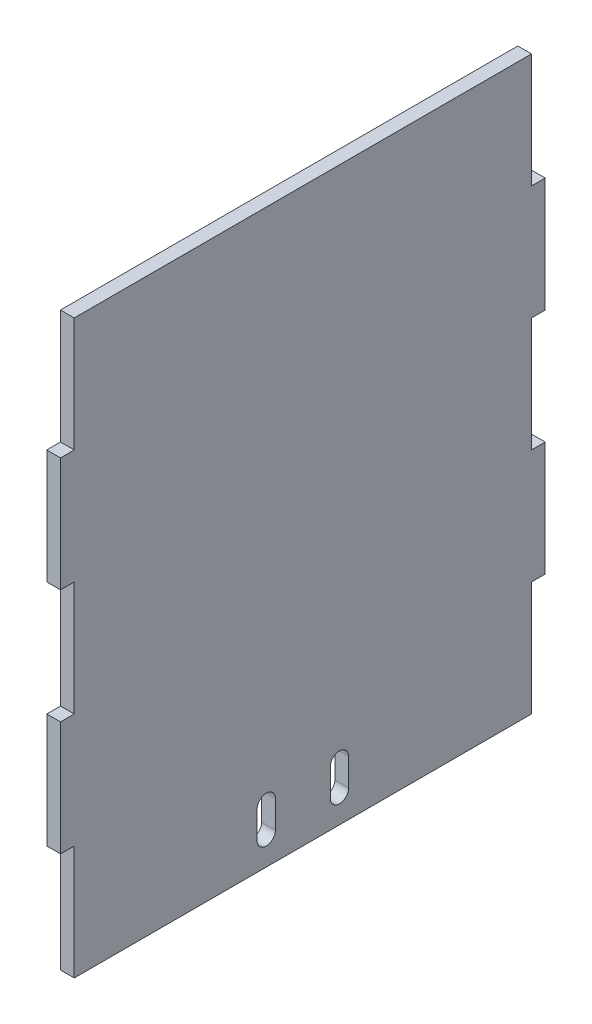
ISO-10303-21;
HEADER;
FILE_DESCRIPTION(('STEP AP214'),'2;1');
FILE_NAME('part.step','',(''),(''),'','','');
FILE_SCHEMA(('AUTOMOTIVE_DESIGN { 1 0 10303 214 1 1 1 1 }'));
ENDSEC;
DATA;
#1=APPLICATION_CONTEXT('core data for automotive mechanical design processes');
#2=APPLICATION_PROTOCOL_DEFINITION('international standard','automotive_design',2000,#1);
#3=PRODUCT_CONTEXT('',#1,'mechanical');
#4=PRODUCT('Part','Part','',(#3));
#5=PRODUCT_RELATED_PRODUCT_CATEGORY('part','',(#4));
#6=PRODUCT_DEFINITION_FORMATION('','',#4);
#7=PRODUCT_DEFINITION_CONTEXT('part definition',#1,'design');
#8=PRODUCT_DEFINITION('design','',#6,#7);
#9=PRODUCT_DEFINITION_SHAPE('','',#8);
#10=(LENGTH_UNIT() NAMED_UNIT(*) SI_UNIT(.MILLI.,.METRE.));
#11=(NAMED_UNIT(*) PLANE_ANGLE_UNIT() SI_UNIT($,.RADIAN.));
#12=(NAMED_UNIT(*) SI_UNIT($,.STERADIAN.) SOLID_ANGLE_UNIT());
#13=UNCERTAINTY_MEASURE_WITH_UNIT(LENGTH_MEASURE(1.E-05),#10,'distance_accuracy_value','');
#14=(GEOMETRIC_REPRESENTATION_CONTEXT(3) GLOBAL_UNCERTAINTY_ASSIGNED_CONTEXT((#13)) GLOBAL_UNIT_ASSIGNED_CONTEXT((#10,
#11,#12)) REPRESENTATION_CONTEXT('',''));
#15=CARTESIAN_POINT('',(0.,0.,0.));
#16=DIRECTION('',(0.,0.,1.));
#17=DIRECTION('',(1.,0.,0.));
#18=AXIS2_PLACEMENT_3D('',#15,#16,#17);
#19=CARTESIAN_POINT('',(3.,28.1962845668765,-53.4829411016602));
#20=DIRECTION('',(0.,0.,1.));
#21=DIRECTION('',(0.,-1.,0.));
#22=AXIS2_PLACEMENT_3D('',#19,#20,#21);
#23=PLANE('',#22);
#24=DIRECTION('',(0.,1.,0.));
#25=VECTOR('',#24,1.);
#26=CARTESIAN_POINT('',(0.,28.1962845668765,-53.4829411016602));
#27=LINE('',#26,#25);
#28=CARTESIAN_POINT('',(0.,3.19628456687655,-53.4829411016604));
#29=VERTEX_POINT('',#28);
#30=CARTESIAN_POINT('',(0.,28.1962845668765,-53.4829411016602));
#31=VERTEX_POINT('',#30);
#32=EDGE_CURVE('E254',#29,#31,#27,.T.);
#33=ORIENTED_EDGE('',*,*,#32,.T.);
#34=DIRECTION('',(-1.,0.,0.));
#35=VECTOR('',#34,1.);
#36=CARTESIAN_POINT('',(3.,28.1962845668765,-53.4829411016602));
#37=LINE('',#36,#35);
#38=CARTESIAN_POINT('',(3.,28.1962845668765,-53.4829411016602));
#39=VERTEX_POINT('',#38);
#40=EDGE_CURVE('E11',#39,#31,#37,.T.);
#41=ORIENTED_EDGE('',*,*,#40,.F.);
#42=DIRECTION('',(0.,1.,0.));
#43=VECTOR('',#42,1.);
#44=CARTESIAN_POINT('',(3.,28.1962845668765,-53.4829411016602));
#45=LINE('',#44,#43);
#46=CARTESIAN_POINT('',(3.,3.19628456687655,-53.4829411016604));
#47=VERTEX_POINT('',#46);
#48=EDGE_CURVE('E287',#47,#39,#45,.T.);
#49=ORIENTED_EDGE('',*,*,#48,.F.);
#50=DIRECTION('',(-1.,0.,0.));
#51=VECTOR('',#50,1.);
#52=CARTESIAN_POINT('',(3.,3.19628456687655,-53.4829411016604));
#53=LINE('',#52,#51);
#54=EDGE_CURVE('E329',#47,#29,#53,.T.);
#55=ORIENTED_EDGE('',*,*,#54,.T.);
#56=EDGE_LOOP('',(#33,#41,#49,#55));
#57=FACE_BOUND('',#56,.T.);
#58=ADVANCED_FACE('F33',(#57),#23,.F.);
#59=CARTESIAN_POINT('',(3.,28.1962845668768,46.5170588983396));
#60=DIRECTION('',(0.,-1.,0.));
#61=DIRECTION('',(0.,0.,-1.));
#62=AXIS2_PLACEMENT_3D('',#59,#60,#61);
#63=PLANE('',#62);
#64=DIRECTION('',(0.,0.,1.));
#65=VECTOR('',#64,1.);
#66=CARTESIAN_POINT('',(0.,28.1962845668768,46.5170588983396));
#67=LINE('',#66,#65);
#68=CARTESIAN_POINT('',(0.,28.1962845668768,46.5170588983396));
#69=VERTEX_POINT('',#68);
#70=EDGE_CURVE('E332',#31,#69,#67,.T.);
#71=ORIENTED_EDGE('',*,*,#70,.T.);
#72=DIRECTION('',(-1.,0.,0.));
#73=VECTOR('',#72,1.);
#74=CARTESIAN_POINT('',(3.,28.1962845668768,46.5170588983396));
#75=LINE('',#74,#73);
#76=CARTESIAN_POINT('',(3.,28.1962845668768,46.5170588983396));
#77=VERTEX_POINT('',#76);
#78=EDGE_CURVE('E40',#77,#69,#75,.T.);
#79=ORIENTED_EDGE('',*,*,#78,.F.);
#80=DIRECTION('',(0.,0.,1.));
#81=VECTOR('',#80,1.);
#82=CARTESIAN_POINT('',(3.,28.1962845668768,46.5170588983396));
#83=LINE('',#82,#81);
#84=EDGE_CURVE('E290',#39,#77,#83,.T.);
#85=ORIENTED_EDGE('',*,*,#84,.F.);
#86=ORIENTED_EDGE('',*,*,#40,.T.);
#87=EDGE_LOOP('',(#71,#79,#85,#86));
#88=FACE_BOUND('',#87,.T.);
#89=ADVANCED_FACE('F448',(#88),#63,.F.);
#90=CARTESIAN_POINT('',(3.,28.1962845668768,46.5170588983396));
#91=DIRECTION('',(0.,0.,-1.));
#92=DIRECTION('',(0.,1.,0.));
#93=AXIS2_PLACEMENT_3D('',#90,#91,#92);
#94=PLANE('',#93);
#95=DIRECTION('',(0.,-1.,0.));
#96=VECTOR('',#95,1.);
#97=CARTESIAN_POINT('',(0.,28.1962845668768,46.5170588983396));
#98=LINE('',#97,#96);
#99=CARTESIAN_POINT('',(0.,3.1962845668768,46.51705889834));
#100=VERTEX_POINT('',#99);
#101=EDGE_CURVE('E334',#69,#100,#98,.T.);
#102=ORIENTED_EDGE('',*,*,#101,.T.);
#103=DIRECTION('',(-1.,0.,0.));
#104=VECTOR('',#103,1.);
#105=CARTESIAN_POINT('',(3.,3.1962845668768,46.51705889834));
#106=LINE('',#105,#104);
#107=CARTESIAN_POINT('',(3.,3.1962845668768,46.51705889834));
#108=VERTEX_POINT('',#107);
#109=EDGE_CURVE('E419',#108,#100,#106,.T.);
#110=ORIENTED_EDGE('',*,*,#109,.F.);
#111=DIRECTION('',(0.,-1.,0.));
#112=VECTOR('',#111,1.);
#113=CARTESIAN_POINT('',(3.,28.1962845668768,46.5170588983396));
#114=LINE('',#113,#112);
#115=EDGE_CURVE('E293',#77,#108,#114,.T.);
#116=ORIENTED_EDGE('',*,*,#115,.F.);
#117=ORIENTED_EDGE('',*,*,#78,.T.);
#118=EDGE_LOOP('',(#102,#110,#116,#117));
#119=FACE_BOUND('',#118,.T.);
#120=ADVANCED_FACE('F426',(#119),#94,.F.);
#121=CARTESIAN_POINT('',(3.,3.1962845668768,46.51705889834));
#122=DIRECTION('',(0.,-1.,0.));
#123=DIRECTION('',(0.,0.,-1.));
#124=AXIS2_PLACEMENT_3D('',#121,#122,#123);
#125=PLANE('',#124);
#126=DIRECTION('',(0.,0.,1.));
#127=VECTOR('',#126,1.);
#128=CARTESIAN_POINT('',(0.,3.1962845668768,46.51705889834));
#129=LINE('',#128,#127);
#130=CARTESIAN_POINT('',(0.,3.19628456687685,49.51705889834));
#131=VERTEX_POINT('',#130);
#132=EDGE_CURVE('E336',#100,#131,#129,.T.);
#133=ORIENTED_EDGE('',*,*,#132,.T.);
#134=DIRECTION('',(-1.,0.,0.));
#135=VECTOR('',#134,1.);
#136=CARTESIAN_POINT('',(3.,3.19628456687685,49.51705889834));
#137=LINE('',#136,#135);
#138=CARTESIAN_POINT('',(3.,3.19628456687685,49.51705889834));
#139=VERTEX_POINT('',#138);
#140=EDGE_CURVE('E416',#139,#131,#137,.T.);
#141=ORIENTED_EDGE('',*,*,#140,.F.);
#142=DIRECTION('',(0.,0.,1.));
#143=VECTOR('',#142,1.);
#144=CARTESIAN_POINT('',(3.,3.1962845668768,46.51705889834));
#145=LINE('',#144,#143);
#146=EDGE_CURVE('E295',#108,#139,#145,.T.);
#147=ORIENTED_EDGE('',*,*,#146,.F.);
#148=ORIENTED_EDGE('',*,*,#109,.T.);
#149=EDGE_LOOP('',(#133,#141,#147,#148));
#150=FACE_BOUND('',#149,.T.);
#151=ADVANCED_FACE('F436',(#150),#125,.F.);
#152=CARTESIAN_POINT('',(3.,3.19628456687685,49.51705889834));
#153=DIRECTION('',(0.,0.,-1.));
#154=DIRECTION('',(0.,1.,0.));
#155=AXIS2_PLACEMENT_3D('',#152,#153,#154);
#156=PLANE('',#155);
#157=DIRECTION('',(0.,-1.,0.));
#158=VECTOR('',#157,1.);
#159=CARTESIAN_POINT('',(0.,3.19628456687685,49.51705889834));
#160=LINE('',#159,#158);
#161=CARTESIAN_POINT('',(0.,-21.8037154331232,49.5170588983404));
#162=VERTEX_POINT('',#161);
#163=EDGE_CURVE('E338',#131,#162,#160,.T.);
#164=ORIENTED_EDGE('',*,*,#163,.T.);
#165=DIRECTION('',(-1.,0.,0.));
#166=VECTOR('',#165,1.);
#167=CARTESIAN_POINT('',(3.,-21.8037154331232,49.5170588983404));
#168=LINE('',#167,#166);
#169=CARTESIAN_POINT('',(3.,-21.8037154331232,49.5170588983404));
#170=VERTEX_POINT('',#169);
#171=EDGE_CURVE('E413',#170,#162,#168,.T.);
#172=ORIENTED_EDGE('',*,*,#171,.F.);
#173=DIRECTION('',(0.,-1.,0.));
#174=VECTOR('',#173,1.);
#175=CARTESIAN_POINT('',(3.,3.19628456687685,49.51705889834));
#176=LINE('',#175,#174);
#177=EDGE_CURVE('E297',#139,#170,#176,.T.);
#178=ORIENTED_EDGE('',*,*,#177,.F.);
#179=ORIENTED_EDGE('',*,*,#140,.T.);
#180=EDGE_LOOP('',(#164,#172,#178,#179));
#181=FACE_BOUND('',#180,.T.);
#182=ADVANCED_FACE('F440',(#181),#156,.F.);
#183=CARTESIAN_POINT('',(3.,-21.8037154331232,49.5170588983404));
#184=DIRECTION('',(0.,1.,0.));
#185=DIRECTION('',(0.,0.,1.));
#186=AXIS2_PLACEMENT_3D('',#183,#184,#185);
#187=PLANE('',#186);
#188=DIRECTION('',(0.,0.,-1.));
#189=VECTOR('',#188,1.);
#190=CARTESIAN_POINT('',(0.,-21.8037154331232,49.5170588983404));
#191=LINE('',#190,#189);
#192=CARTESIAN_POINT('',(0.,-21.8037154331234,46.5170588983391));
#193=VERTEX_POINT('',#192);
#194=EDGE_CURVE('E340',#162,#193,#191,.T.);
#195=ORIENTED_EDGE('',*,*,#194,.T.);
#196=DIRECTION('',(-1.,0.,0.));
#197=VECTOR('',#196,1.);
#198=CARTESIAN_POINT('',(3.,-21.8037154331234,46.5170588983391));
#199=LINE('',#198,#197);
#200=CARTESIAN_POINT('',(3.,-21.8037154331234,46.5170588983391));
#201=VERTEX_POINT('',#200);
#202=EDGE_CURVE('E410',#201,#193,#199,.T.);
#203=ORIENTED_EDGE('',*,*,#202,.F.);
#204=DIRECTION('',(0.,0.,-1.));
#205=VECTOR('',#204,1.);
#206=CARTESIAN_POINT('',(3.,-21.8037154331232,49.5170588983404));
#207=LINE('',#206,#205);
#208=EDGE_CURVE('E299',#170,#201,#207,.T.);
#209=ORIENTED_EDGE('',*,*,#208,.F.);
#210=ORIENTED_EDGE('',*,*,#171,.T.);
#211=EDGE_LOOP('',(#195,#203,#209,#210));
#212=FACE_BOUND('',#211,.T.);
#213=ADVANCED_FACE('F521',(#212),#187,.F.);
#214=CARTESIAN_POINT('',(3.,-21.8037154331234,46.5170588983391));
#215=DIRECTION('',(0.,0.,-1.));
#216=DIRECTION('',(0.,1.,0.));
#217=AXIS2_PLACEMENT_3D('',#214,#215,#216);
#218=PLANE('',#217);
#219=DIRECTION('',(0.,-1.,0.));
#220=VECTOR('',#219,1.);
#221=CARTESIAN_POINT('',(0.,-21.8037154331234,46.5170588983391));
#222=LINE('',#221,#220);
#223=CARTESIAN_POINT('',(0.,-46.803715433124,46.5170588983401));
#224=VERTEX_POINT('',#223);
#225=EDGE_CURVE('E342',#193,#224,#222,.T.);
#226=ORIENTED_EDGE('',*,*,#225,.T.);
#227=DIRECTION('',(-1.,0.,0.));
#228=VECTOR('',#227,1.);
#229=CARTESIAN_POINT('',(3.,-46.803715433124,46.5170588983401));
#230=LINE('',#229,#228);
#231=CARTESIAN_POINT('',(3.,-46.803715433124,46.5170588983401));
#232=VERTEX_POINT('',#231);
#233=EDGE_CURVE('E407',#232,#224,#230,.T.);
#234=ORIENTED_EDGE('',*,*,#233,.F.);
#235=DIRECTION('',(0.,-1.,0.));
#236=VECTOR('',#235,1.);
#237=CARTESIAN_POINT('',(3.,-21.8037154331234,46.5170588983391));
#238=LINE('',#237,#236);
#239=EDGE_CURVE('E301',#201,#232,#238,.T.);
#240=ORIENTED_EDGE('',*,*,#239,.F.);
#241=ORIENTED_EDGE('',*,*,#202,.T.);
#242=EDGE_LOOP('',(#226,#234,#240,#241));
#243=FACE_BOUND('',#242,.T.);
#244=ADVANCED_FACE('F519',(#243),#218,.F.);
#245=CARTESIAN_POINT('',(3.,-46.803715433124,46.5170588983401));
#246=DIRECTION('',(0.,-1.,0.));
#247=DIRECTION('',(0.,0.,-1.));
#248=AXIS2_PLACEMENT_3D('',#245,#246,#247);
#249=PLANE('',#248);
#250=DIRECTION('',(0.,0.,1.));
#251=VECTOR('',#250,1.);
#252=CARTESIAN_POINT('',(0.,-46.803715433124,46.5170588983401));
#253=LINE('',#252,#251);
#254=CARTESIAN_POINT('',(0.,-46.803715433124,49.5170588983401));
#255=VERTEX_POINT('',#254);
#256=EDGE_CURVE('E344',#224,#255,#253,.T.);
#257=ORIENTED_EDGE('',*,*,#256,.T.);
#258=DIRECTION('',(-1.,0.,0.));
#259=VECTOR('',#258,1.);
#260=CARTESIAN_POINT('',(3.,-46.803715433124,49.5170588983401));
#261=LINE('',#260,#259);
#262=CARTESIAN_POINT('',(3.,-46.803715433124,49.5170588983401));
#263=VERTEX_POINT('',#262);
#264=EDGE_CURVE('E404',#263,#255,#261,.T.);
#265=ORIENTED_EDGE('',*,*,#264,.F.);
#266=DIRECTION('',(0.,0.,1.));
#267=VECTOR('',#266,1.);
#268=CARTESIAN_POINT('',(3.,-46.803715433124,46.5170588983401));
#269=LINE('',#268,#267);
#270=EDGE_CURVE('E303',#232,#263,#269,.T.);
#271=ORIENTED_EDGE('',*,*,#270,.F.);
#272=ORIENTED_EDGE('',*,*,#233,.T.);
#273=EDGE_LOOP('',(#257,#265,#271,#272));
#274=FACE_BOUND('',#273,.T.);
#275=ADVANCED_FACE('F514',(#274),#249,.F.);
#276=CARTESIAN_POINT('',(3.,-46.803715433124,49.5170588983401));
#277=DIRECTION('',(0.,0.,-1.));
#278=DIRECTION('',(-1.,0.,0.));
#279=AXIS2_PLACEMENT_3D('',#276,#277,#278);
#280=PLANE('',#279);
#281=DIRECTION('',(0.,-1.,0.));
#282=VECTOR('',#281,1.);
#283=CARTESIAN_POINT('',(0.,-46.803715433124,49.5170588983401));
#284=LINE('',#283,#282);
#285=CARTESIAN_POINT('',(0.,-71.803715433124,49.5170588983401));
#286=VERTEX_POINT('',#285);
#287=EDGE_CURVE('E346',#255,#286,#284,.T.);
#288=ORIENTED_EDGE('',*,*,#287,.T.);
#289=DIRECTION('',(-1.,0.,0.));
#290=VECTOR('',#289,1.);
#291=CARTESIAN_POINT('',(3.,-71.803715433124,49.5170588983401));
#292=LINE('',#291,#290);
#293=CARTESIAN_POINT('',(3.,-71.803715433124,49.5170588983401));
#294=VERTEX_POINT('',#293);
#295=EDGE_CURVE('E401',#294,#286,#292,.T.);
#296=ORIENTED_EDGE('',*,*,#295,.F.);
#297=DIRECTION('',(0.,-1.,0.));
#298=VECTOR('',#297,1.);
#299=CARTESIAN_POINT('',(3.,-46.803715433124,49.5170588983401));
#300=LINE('',#299,#298);
#301=EDGE_CURVE('E305',#263,#294,#300,.T.);
#302=ORIENTED_EDGE('',*,*,#301,.F.);
#303=ORIENTED_EDGE('',*,*,#264,.T.);
#304=EDGE_LOOP('',(#288,#296,#302,#303));
#305=FACE_BOUND('',#304,.T.);
#306=ADVANCED_FACE('F509',(#305),#280,.F.);
#307=CARTESIAN_POINT('',(3.,-71.803715433124,49.5170588983401));
#308=DIRECTION('',(0.,1.,0.));
#309=DIRECTION('',(0.,0.,1.));
#310=AXIS2_PLACEMENT_3D('',#307,#308,#309);
#311=PLANE('',#310);
#312=DIRECTION('',(0.,0.,-1.));
#313=VECTOR('',#312,1.);
#314=CARTESIAN_POINT('',(0.,-71.803715433124,49.5170588983401));
#315=LINE('',#314,#313);
#316=CARTESIAN_POINT('',(0.,-71.803715433124,46.5170588983401));
#317=VERTEX_POINT('',#316);
#318=EDGE_CURVE('E348',#286,#317,#315,.T.);
#319=ORIENTED_EDGE('',*,*,#318,.T.);
#320=DIRECTION('',(-1.,0.,0.));
#321=VECTOR('',#320,1.);
#322=CARTESIAN_POINT('',(3.,-71.803715433124,46.5170588983401));
#323=LINE('',#322,#321);
#324=CARTESIAN_POINT('',(3.,-71.803715433124,46.5170588983401));
#325=VERTEX_POINT('',#324);
#326=EDGE_CURVE('E398',#325,#317,#323,.T.);
#327=ORIENTED_EDGE('',*,*,#326,.F.);
#328=DIRECTION('',(0.,0.,-1.));
#329=VECTOR('',#328,1.);
#330=CARTESIAN_POINT('',(3.,-71.803715433124,49.5170588983401));
#331=LINE('',#330,#329);
#332=EDGE_CURVE('E307',#294,#325,#331,.T.);
#333=ORIENTED_EDGE('',*,*,#332,.F.);
#334=ORIENTED_EDGE('',*,*,#295,.T.);
#335=EDGE_LOOP('',(#319,#327,#333,#334));
#336=FACE_BOUND('',#335,.T.);
#337=ADVANCED_FACE('F505',(#336),#311,.F.);
#338=CARTESIAN_POINT('',(3.,-96.803715433124,46.5170588983358));
#339=DIRECTION('',(0.,1.71251901548431E-13,-1.));
#340=DIRECTION('',(0.,1.,1.71251901548431E-13));
#341=AXIS2_PLACEMENT_3D('',#338,#339,#340);
#342=PLANE('',#341);
#343=DIRECTION('',(0.,-1.,-1.71251901548431E-13));
#344=VECTOR('',#343,1.);
#345=CARTESIAN_POINT('',(0.,-96.803715433124,46.5170588983358));
#346=LINE('',#345,#344);
#347=CARTESIAN_POINT('',(0.,-96.803715433124,46.5170588983358));
#348=VERTEX_POINT('',#347);
#349=EDGE_CURVE('E350',#317,#348,#346,.T.);
#350=ORIENTED_EDGE('',*,*,#349,.T.);
#351=DIRECTION('',(-1.,0.,0.));
#352=VECTOR('',#351,1.);
#353=CARTESIAN_POINT('',(3.,-96.803715433124,46.5170588983358));
#354=LINE('',#353,#352);
#355=CARTESIAN_POINT('',(3.,-96.803715433124,46.5170588983358));
#356=VERTEX_POINT('',#355);
#357=EDGE_CURVE('E395',#356,#348,#354,.T.);
#358=ORIENTED_EDGE('',*,*,#357,.F.);
#359=DIRECTION('',(0.,-1.,-1.71251901548431E-13));
#360=VECTOR('',#359,1.);
#361=CARTESIAN_POINT('',(3.,-96.803715433124,46.5170588983358));
#362=LINE('',#361,#360);
#363=EDGE_CURVE('E309',#325,#356,#362,.T.);
#364=ORIENTED_EDGE('',*,*,#363,.F.);
#365=ORIENTED_EDGE('',*,*,#326,.T.);
#366=EDGE_LOOP('',(#350,#358,#364,#365));
#367=FACE_BOUND('',#366,.T.);
#368=ADVANCED_FACE('F500',(#367),#342,.F.);
#369=CARTESIAN_POINT('',(3.,-96.803715433124,-53.4829411016566));
#370=DIRECTION('',(0.,1.,0.));
#371=DIRECTION('',(0.,0.,1.));
#372=AXIS2_PLACEMENT_3D('',#369,#370,#371);
#373=PLANE('',#372);
#374=DIRECTION('',(0.,0.,-1.));
#375=VECTOR('',#374,1.);
#376=CARTESIAN_POINT('',(0.,-96.803715433124,-53.4829411016566));
#377=LINE('',#376,#375);
#378=CARTESIAN_POINT('',(0.,-96.803715433124,-53.4829411016566));
#379=VERTEX_POINT('',#378);
#380=EDGE_CURVE('E352',#348,#379,#377,.T.);
#381=ORIENTED_EDGE('',*,*,#380,.T.);
#382=DIRECTION('',(-1.,0.,0.));
#383=VECTOR('',#382,1.);
#384=CARTESIAN_POINT('',(3.,-96.803715433124,-53.4829411016566));
#385=LINE('',#384,#383);
#386=CARTESIAN_POINT('',(3.,-96.803715433124,-53.4829411016566));
#387=VERTEX_POINT('',#386);
#388=EDGE_CURVE('E392',#387,#379,#385,.T.);
#389=ORIENTED_EDGE('',*,*,#388,.F.);
#390=DIRECTION('',(0.,0.,-1.));
#391=VECTOR('',#390,1.);
#392=CARTESIAN_POINT('',(3.,-96.803715433124,-53.4829411016566));
#393=LINE('',#392,#391);
#394=EDGE_CURVE('E311',#356,#387,#393,.T.);
#395=ORIENTED_EDGE('',*,*,#394,.F.);
#396=ORIENTED_EDGE('',*,*,#357,.T.);
#397=EDGE_LOOP('',(#381,#389,#395,#396));
#398=FACE_BOUND('',#397,.T.);
#399=ADVANCED_FACE('F494',(#398),#373,.F.);
#400=CARTESIAN_POINT('',(3.,-96.803715433124,-53.4829411016566));
#401=DIRECTION('',(0.,1.74027459109993E-13,1.));
#402=DIRECTION('',(0.,-1.,1.74027459109993E-13));
#403=AXIS2_PLACEMENT_3D('',#400,#401,#402);
#404=PLANE('',#403);
#405=DIRECTION('',(0.,1.,-1.74027459109993E-13));
#406=VECTOR('',#405,1.);
#407=CARTESIAN_POINT('',(0.,-96.803715433124,-53.4829411016566));
#408=LINE('',#407,#406);
#409=CARTESIAN_POINT('',(0.,-71.803715433124,-53.482941101661));
#410=VERTEX_POINT('',#409);
#411=EDGE_CURVE('E354',#379,#410,#408,.T.);
#412=ORIENTED_EDGE('',*,*,#411,.T.);
#413=DIRECTION('',(-1.,0.,0.));
#414=VECTOR('',#413,1.);
#415=CARTESIAN_POINT('',(3.,-71.803715433124,-53.482941101661));
#416=LINE('',#415,#414);
#417=CARTESIAN_POINT('',(3.,-71.803715433124,-53.482941101661));
#418=VERTEX_POINT('',#417);
#419=EDGE_CURVE('E389',#418,#410,#416,.T.);
#420=ORIENTED_EDGE('',*,*,#419,.F.);
#421=DIRECTION('',(0.,1.,-1.74027459109993E-13));
#422=VECTOR('',#421,1.);
#423=CARTESIAN_POINT('',(3.,-96.803715433124,-53.4829411016566));
#424=LINE('',#423,#422);
#425=EDGE_CURVE('E313',#387,#418,#424,.T.);
#426=ORIENTED_EDGE('',*,*,#425,.F.);
#427=ORIENTED_EDGE('',*,*,#388,.T.);
#428=EDGE_LOOP('',(#412,#420,#426,#427));
#429=FACE_BOUND('',#428,.T.);
#430=ADVANCED_FACE('F490',(#429),#404,.F.);
#431=CARTESIAN_POINT('',(3.,-71.803715433124,-56.482941101661));
#432=DIRECTION('',(0.,1.,0.));
#433=DIRECTION('',(0.,0.,1.));
#434=AXIS2_PLACEMENT_3D('',#431,#432,#433);
#435=PLANE('',#434);
#436=DIRECTION('',(0.,0.,-1.));
#437=VECTOR('',#436,1.);
#438=CARTESIAN_POINT('',(0.,-71.803715433124,-56.482941101661));
#439=LINE('',#438,#437);
#440=CARTESIAN_POINT('',(0.,-71.803715433124,-56.482941101661));
#441=VERTEX_POINT('',#440);
#442=EDGE_CURVE('E356',#410,#441,#439,.T.);
#443=ORIENTED_EDGE('',*,*,#442,.T.);
#444=DIRECTION('',(-1.,0.,0.));
#445=VECTOR('',#444,1.);
#446=CARTESIAN_POINT('',(3.,-71.803715433124,-56.482941101661));
#447=LINE('',#446,#445);
#448=CARTESIAN_POINT('',(3.,-71.803715433124,-56.482941101661));
#449=VERTEX_POINT('',#448);
#450=EDGE_CURVE('E386',#449,#441,#447,.T.);
#451=ORIENTED_EDGE('',*,*,#450,.F.);
#452=DIRECTION('',(0.,0.,-1.));
#453=VECTOR('',#452,1.);
#454=CARTESIAN_POINT('',(3.,-71.803715433124,-56.482941101661));
#455=LINE('',#454,#453);
#456=EDGE_CURVE('E315',#418,#449,#455,.T.);
#457=ORIENTED_EDGE('',*,*,#456,.F.);
#458=ORIENTED_EDGE('',*,*,#419,.T.);
#459=EDGE_LOOP('',(#443,#451,#457,#458));
#460=FACE_BOUND('',#459,.T.);
#461=ADVANCED_FACE('F485',(#460),#435,.F.);
#462=CARTESIAN_POINT('',(3.,-46.803715433124,-56.482941101661));
#463=DIRECTION('',(0.,0.,1.));
#464=DIRECTION('',(1.,0.,0.));
#465=AXIS2_PLACEMENT_3D('',#462,#463,#464);
#466=PLANE('',#465);
#467=DIRECTION('',(0.,1.,0.));
#468=VECTOR('',#467,1.);
#469=CARTESIAN_POINT('',(0.,-46.803715433124,-56.482941101661));
#470=LINE('',#469,#468);
#471=CARTESIAN_POINT('',(0.,-46.803715433124,-56.482941101661));
#472=VERTEX_POINT('',#471);
#473=EDGE_CURVE('E358',#441,#472,#470,.T.);
#474=ORIENTED_EDGE('',*,*,#473,.T.);
#475=DIRECTION('',(-1.,0.,0.));
#476=VECTOR('',#475,1.);
#477=CARTESIAN_POINT('',(3.,-46.803715433124,-56.482941101661));
#478=LINE('',#477,#476);
#479=CARTESIAN_POINT('',(3.,-46.803715433124,-56.482941101661));
#480=VERTEX_POINT('',#479);
#481=EDGE_CURVE('E383',#480,#472,#478,.T.);
#482=ORIENTED_EDGE('',*,*,#481,.F.);
#483=DIRECTION('',(0.,1.,0.));
#484=VECTOR('',#483,1.);
#485=CARTESIAN_POINT('',(3.,-46.803715433124,-56.482941101661));
#486=LINE('',#485,#484);
#487=EDGE_CURVE('E317',#449,#480,#486,.T.);
#488=ORIENTED_EDGE('',*,*,#487,.F.);
#489=ORIENTED_EDGE('',*,*,#450,.T.);
#490=EDGE_LOOP('',(#474,#482,#488,#489));
#491=FACE_BOUND('',#490,.T.);
#492=ADVANCED_FACE('F479',(#491),#466,.F.);
#493=CARTESIAN_POINT('',(3.,-46.803715433124,-53.482941101661));
#494=DIRECTION('',(0.,-1.,0.));
#495=DIRECTION('',(0.,0.,-1.));
#496=AXIS2_PLACEMENT_3D('',#493,#494,#495);
#497=PLANE('',#496);
#498=DIRECTION('',(0.,0.,1.));
#499=VECTOR('',#498,1.);
#500=CARTESIAN_POINT('',(0.,-46.803715433124,-53.482941101661));
#501=LINE('',#500,#499);
#502=CARTESIAN_POINT('',(0.,-46.803715433124,-53.482941101661));
#503=VERTEX_POINT('',#502);
#504=EDGE_CURVE('E360',#472,#503,#501,.T.);
#505=ORIENTED_EDGE('',*,*,#504,.T.);
#506=DIRECTION('',(-1.,0.,0.));
#507=VECTOR('',#506,1.);
#508=CARTESIAN_POINT('',(3.,-46.803715433124,-53.482941101661));
#509=LINE('',#508,#507);
#510=CARTESIAN_POINT('',(3.,-46.803715433124,-53.482941101661));
#511=VERTEX_POINT('',#510);
#512=EDGE_CURVE('E380',#511,#503,#509,.T.);
#513=ORIENTED_EDGE('',*,*,#512,.F.);
#514=DIRECTION('',(0.,0.,1.));
#515=VECTOR('',#514,1.);
#516=CARTESIAN_POINT('',(3.,-46.803715433124,-53.482941101661));
#517=LINE('',#516,#515);
#518=EDGE_CURVE('E319',#480,#511,#517,.T.);
#519=ORIENTED_EDGE('',*,*,#518,.F.);
#520=ORIENTED_EDGE('',*,*,#481,.T.);
#521=EDGE_LOOP('',(#505,#513,#519,#520));
#522=FACE_BOUND('',#521,.T.);
#523=ADVANCED_FACE('F475',(#522),#497,.F.);
#524=CARTESIAN_POINT('',(3.,-21.8037154331234,-53.4829411016607));
#525=DIRECTION('',(0.,0.,1.));
#526=DIRECTION('',(0.,-1.,0.));
#527=AXIS2_PLACEMENT_3D('',#524,#525,#526);
#528=PLANE('',#527);
#529=DIRECTION('',(0.,1.,0.));
#530=VECTOR('',#529,1.);
#531=CARTESIAN_POINT('',(0.,-21.8037154331234,-53.4829411016607));
#532=LINE('',#531,#530);
#533=CARTESIAN_POINT('',(0.,-21.8037154331234,-53.4829411016607));
#534=VERTEX_POINT('',#533);
#535=EDGE_CURVE('E362',#503,#534,#532,.T.);
#536=ORIENTED_EDGE('',*,*,#535,.T.);
#537=DIRECTION('',(-1.,0.,0.));
#538=VECTOR('',#537,1.);
#539=CARTESIAN_POINT('',(3.,-21.8037154331234,-53.4829411016607));
#540=LINE('',#539,#538);
#541=CARTESIAN_POINT('',(3.,-21.8037154331234,-53.4829411016607));
#542=VERTEX_POINT('',#541);
#543=EDGE_CURVE('E377',#542,#534,#540,.T.);
#544=ORIENTED_EDGE('',*,*,#543,.F.);
#545=DIRECTION('',(0.,1.,0.));
#546=VECTOR('',#545,1.);
#547=CARTESIAN_POINT('',(3.,-21.8037154331234,-53.4829411016607));
#548=LINE('',#547,#546);
#549=EDGE_CURVE('E321',#511,#542,#548,.T.);
#550=ORIENTED_EDGE('',*,*,#549,.F.);
#551=ORIENTED_EDGE('',*,*,#512,.T.);
#552=EDGE_LOOP('',(#536,#544,#550,#551));
#553=FACE_BOUND('',#552,.T.);
#554=ADVANCED_FACE('F470',(#553),#528,.F.);
#555=CARTESIAN_POINT('',(3.,-21.8037154331234,-56.4829411016607));
#556=DIRECTION('',(0.,1.,0.));
#557=DIRECTION('',(0.,0.,1.));
#558=AXIS2_PLACEMENT_3D('',#555,#556,#557);
#559=PLANE('',#558);
#560=DIRECTION('',(0.,0.,-1.));
#561=VECTOR('',#560,1.);
#562=CARTESIAN_POINT('',(0.,-21.8037154331234,-56.4829411016607));
#563=LINE('',#562,#561);
#564=CARTESIAN_POINT('',(0.,-21.8037154331234,-56.4829411016607));
#565=VERTEX_POINT('',#564);
#566=EDGE_CURVE('E364',#534,#565,#563,.T.);
#567=ORIENTED_EDGE('',*,*,#566,.T.);
#568=DIRECTION('',(-1.,0.,0.));
#569=VECTOR('',#568,1.);
#570=CARTESIAN_POINT('',(3.,-21.8037154331234,-56.4829411016607));
#571=LINE('',#570,#569);
#572=CARTESIAN_POINT('',(3.,-21.8037154331234,-56.4829411016607));
#573=VERTEX_POINT('',#572);
#574=EDGE_CURVE('E374',#573,#565,#571,.T.);
#575=ORIENTED_EDGE('',*,*,#574,.F.);
#576=DIRECTION('',(0.,0.,-1.));
#577=VECTOR('',#576,1.);
#578=CARTESIAN_POINT('',(3.,-21.8037154331234,-56.4829411016607));
#579=LINE('',#578,#577);
#580=EDGE_CURVE('E323',#542,#573,#579,.T.);
#581=ORIENTED_EDGE('',*,*,#580,.F.);
#582=ORIENTED_EDGE('',*,*,#543,.T.);
#583=EDGE_LOOP('',(#567,#575,#581,#582));
#584=FACE_BOUND('',#583,.T.);
#585=ADVANCED_FACE('F464',(#584),#559,.F.);
#586=CARTESIAN_POINT('',(3.,3.19628456687659,-56.4829411016604));
#587=DIRECTION('',(0.,0.,1.));
#588=DIRECTION('',(0.,-1.,0.));
#589=AXIS2_PLACEMENT_3D('',#586,#587,#588);
#590=PLANE('',#589);
#591=DIRECTION('',(0.,1.,0.));
#592=VECTOR('',#591,1.);
#593=CARTESIAN_POINT('',(0.,3.19628456687659,-56.4829411016604));
#594=LINE('',#593,#592);
#595=CARTESIAN_POINT('',(0.,3.19628456687659,-56.4829411016604));
#596=VERTEX_POINT('',#595);
#597=EDGE_CURVE('E366',#565,#596,#594,.T.);
#598=ORIENTED_EDGE('',*,*,#597,.T.);
#599=DIRECTION('',(-1.,0.,0.));
#600=VECTOR('',#599,1.);
#601=CARTESIAN_POINT('',(3.,3.19628456687659,-56.4829411016604));
#602=LINE('',#601,#600);
#603=CARTESIAN_POINT('',(3.,3.19628456687659,-56.4829411016604));
#604=VERTEX_POINT('',#603);
#605=EDGE_CURVE('E371',#604,#596,#602,.T.);
#606=ORIENTED_EDGE('',*,*,#605,.F.);
#607=DIRECTION('',(0.,1.,0.));
#608=VECTOR('',#607,1.);
#609=CARTESIAN_POINT('',(3.,3.19628456687659,-56.4829411016604));
#610=LINE('',#609,#608);
#611=EDGE_CURVE('E325',#573,#604,#610,.T.);
#612=ORIENTED_EDGE('',*,*,#611,.F.);
#613=ORIENTED_EDGE('',*,*,#574,.T.);
#614=EDGE_LOOP('',(#598,#606,#612,#613));
#615=FACE_BOUND('',#614,.T.);
#616=ADVANCED_FACE('F460',(#615),#590,.F.);
#617=CARTESIAN_POINT('',(3.,3.19628456687655,-53.4829411016604));
#618=DIRECTION('',(0.,-1.,0.));
#619=DIRECTION('',(0.,0.,-1.));
#620=AXIS2_PLACEMENT_3D('',#617,#618,#619);
#621=PLANE('',#620);
#622=DIRECTION('',(0.,0.,1.));
#623=VECTOR('',#622,1.);
#624=CARTESIAN_POINT('',(0.,3.19628456687655,-53.4829411016604));
#625=LINE('',#624,#623);
#626=EDGE_CURVE('E291',#596,#29,#625,.T.);
#627=ORIENTED_EDGE('',*,*,#626,.T.);
#628=ORIENTED_EDGE('',*,*,#54,.F.);
#629=DIRECTION('',(0.,0.,1.));
#630=VECTOR('',#629,1.);
#631=CARTESIAN_POINT('',(3.,3.19628456687655,-53.4829411016604));
#632=LINE('',#631,#630);
#633=EDGE_CURVE('E327',#604,#47,#632,.T.);
#634=ORIENTED_EDGE('',*,*,#633,.F.);
#635=ORIENTED_EDGE('',*,*,#605,.T.);
#636=EDGE_LOOP('',(#627,#628,#634,#635));
#637=FACE_BOUND('',#636,.T.);
#638=ADVANCED_FACE('F455',(#637),#621,.F.);
#639=CARTESIAN_POINT('',(3.,0.,0.));
#640=DIRECTION('',(1.,0.,0.));
#641=DIRECTION('',(0.,0.,-1.));
#642=AXIS2_PLACEMENT_3D('',#639,#640,#641);
#643=PLANE('',#642);
#644=CARTESIAN_POINT('',(3.,-90.803715433124,4.51705889833958));
#645=DIRECTION('',(1.,0.,0.));
#646=DIRECTION('',(0.,0.,-1.));
#647=AXIS2_PLACEMENT_3D('',#644,#645,#646);
#648=CIRCLE('',#647,2.);
#649=CARTESIAN_POINT('',(3.,-90.803715433124,6.51705889833958));
#650=VERTEX_POINT('',#649);
#651=CARTESIAN_POINT('',(3.,-90.803715433124,2.51705889833958));
#652=VERTEX_POINT('',#651);
#653=EDGE_CURVE('E47',#650,#652,#648,.T.);
#654=ORIENTED_EDGE('',*,*,#653,.F.);
#655=DIRECTION('',(0.,-1.,0.));
#656=VECTOR('',#655,1.);
#657=CARTESIAN_POINT('',(3.,-90.803715433124,6.51705889833958));
#658=LINE('',#657,#656);
#659=CARTESIAN_POINT('',(3.,-84.803715433124,6.51705889833958));
#660=VERTEX_POINT('',#659);
#661=EDGE_CURVE('E238',#660,#650,#658,.T.);
#662=ORIENTED_EDGE('',*,*,#661,.F.);
#663=CARTESIAN_POINT('',(3.,-84.803715433124,4.51705889833958));
#664=DIRECTION('',(1.,0.,0.));
#665=DIRECTION('',(0.,0.,-1.));
#666=AXIS2_PLACEMENT_3D('',#663,#664,#665);
#667=CIRCLE('',#666,2.);
#668=CARTESIAN_POINT('',(3.,-84.803715433124,2.51705889833959));
#669=VERTEX_POINT('',#668);
#670=EDGE_CURVE('E241',#669,#660,#667,.T.);
#671=ORIENTED_EDGE('',*,*,#670,.F.);
#672=DIRECTION('',(0.,1.,0.));
#673=VECTOR('',#672,1.);
#674=CARTESIAN_POINT('',(3.,-90.803715433124,2.51705889833958));
#675=LINE('',#674,#673);
#676=EDGE_CURVE('E247',#652,#669,#675,.T.);
#677=ORIENTED_EDGE('',*,*,#676,.F.);
#678=EDGE_LOOP('',(#654,#662,#671,#677));
#679=FACE_BOUND('',#678,.T.);
#680=CARTESIAN_POINT('',(3.,-90.803715433124,-11.4829411016604));
#681=DIRECTION('',(1.,0.,0.));
#682=DIRECTION('',(0.,0.,1.));
#683=AXIS2_PLACEMENT_3D('',#680,#681,#682);
#684=CIRCLE('',#683,2.);
#685=CARTESIAN_POINT('',(3.,-90.803715433124,-9.48294110166042));
#686=VERTEX_POINT('',#685);
#687=CARTESIAN_POINT('',(3.,-90.803715433124,-13.4829411016604));
#688=VERTEX_POINT('',#687);
#689=EDGE_CURVE('E55',#686,#688,#684,.T.);
#690=ORIENTED_EDGE('',*,*,#689,.F.);
#691=DIRECTION('',(0.,-1.,0.));
#692=VECTOR('',#691,1.);
#693=CARTESIAN_POINT('',(3.,-90.803715433124,-9.48294110166042));
#694=LINE('',#693,#692);
#695=CARTESIAN_POINT('',(3.,-84.803715433124,-9.48294110166042));
#696=VERTEX_POINT('',#695);
#697=EDGE_CURVE('E262',#696,#686,#694,.T.);
#698=ORIENTED_EDGE('',*,*,#697,.F.);
#699=CARTESIAN_POINT('',(3.,-84.803715433124,-11.4829411016604));
#700=DIRECTION('',(1.,0.,0.));
#701=DIRECTION('',(0.,0.,1.));
#702=AXIS2_PLACEMENT_3D('',#699,#700,#701);
#703=CIRCLE('',#702,2.);
#704=CARTESIAN_POINT('',(3.,-84.803715433124,-13.4829411016604));
#705=VERTEX_POINT('',#704);
#706=EDGE_CURVE('E276',#705,#696,#703,.T.);
#707=ORIENTED_EDGE('',*,*,#706,.F.);
#708=DIRECTION('',(0.,1.,0.));
#709=VECTOR('',#708,1.);
#710=CARTESIAN_POINT('',(3.,-90.803715433124,-13.4829411016604));
#711=LINE('',#710,#709);
#712=EDGE_CURVE('E273',#688,#705,#711,.T.);
#713=ORIENTED_EDGE('',*,*,#712,.F.);
#714=EDGE_LOOP('',(#690,#698,#707,#713));
#715=FACE_BOUND('',#714,.T.);
#716=ORIENTED_EDGE('',*,*,#48,.T.);
#717=ORIENTED_EDGE('',*,*,#84,.T.);
#718=ORIENTED_EDGE('',*,*,#115,.T.);
#719=ORIENTED_EDGE('',*,*,#146,.T.);
#720=ORIENTED_EDGE('',*,*,#177,.T.);
#721=ORIENTED_EDGE('',*,*,#208,.T.);
#722=ORIENTED_EDGE('',*,*,#239,.T.);
#723=ORIENTED_EDGE('',*,*,#270,.T.);
#724=ORIENTED_EDGE('',*,*,#301,.T.);
#725=ORIENTED_EDGE('',*,*,#332,.T.);
#726=ORIENTED_EDGE('',*,*,#363,.T.);
#727=ORIENTED_EDGE('',*,*,#394,.T.);
#728=ORIENTED_EDGE('',*,*,#425,.T.);
#729=ORIENTED_EDGE('',*,*,#456,.T.);
#730=ORIENTED_EDGE('',*,*,#487,.T.);
#731=ORIENTED_EDGE('',*,*,#518,.T.);
#732=ORIENTED_EDGE('',*,*,#549,.T.);
#733=ORIENTED_EDGE('',*,*,#580,.T.);
#734=ORIENTED_EDGE('',*,*,#611,.T.);
#735=ORIENTED_EDGE('',*,*,#633,.T.);
#736=EDGE_LOOP('',(#716,#717,#718,#719,#720,#721,#722,#723,#724,#725,#726,#727,#728,#729,#730,
#731,#732,#733,#734,#735));
#737=FACE_BOUND('',#736,.T.);
#738=ADVANCED_FACE('F444',(#679,#715,#737),#643,.T.);
#739=CARTESIAN_POINT('',(0.,0.,0.));
#740=DIRECTION('',(1.,0.,0.));
#741=DIRECTION('',(0.,0.,-1.));
#742=AXIS2_PLACEMENT_3D('',#739,#740,#741);
#743=PLANE('',#742);
#744=DIRECTION('',(0.,-1.,0.));
#745=VECTOR('',#744,1.);
#746=CARTESIAN_POINT('',(0.,-90.803715433124,6.51705889833958));
#747=LINE('',#746,#745);
#748=CARTESIAN_POINT('',(0.,-84.803715433124,6.51705889833958));
#749=VERTEX_POINT('',#748);
#750=CARTESIAN_POINT('',(0.,-90.803715433124,6.51705889833958));
#751=VERTEX_POINT('',#750);
#752=EDGE_CURVE('E225',#749,#751,#747,.T.);
#753=ORIENTED_EDGE('',*,*,#752,.T.);
#754=CARTESIAN_POINT('',(0.,-90.803715433124,4.51705889833958));
#755=DIRECTION('',(1.,0.,0.));
#756=DIRECTION('',(0.,0.,-1.));
#757=AXIS2_PLACEMENT_3D('',#754,#755,#756);
#758=CIRCLE('',#757,2.);
#759=CARTESIAN_POINT('',(0.,-90.803715433124,2.51705889833958));
#760=VERTEX_POINT('',#759);
#761=EDGE_CURVE('E219',#751,#760,#758,.T.);
#762=ORIENTED_EDGE('',*,*,#761,.T.);
#763=DIRECTION('',(0.,1.,0.));
#764=VECTOR('',#763,1.);
#765=CARTESIAN_POINT('',(0.,-90.803715433124,2.51705889833958));
#766=LINE('',#765,#764);
#767=CARTESIAN_POINT('',(0.,-84.803715433124,2.51705889833959));
#768=VERTEX_POINT('',#767);
#769=EDGE_CURVE('E229',#760,#768,#766,.T.);
#770=ORIENTED_EDGE('',*,*,#769,.T.);
#771=CARTESIAN_POINT('',(0.,-84.803715433124,4.51705889833958));
#772=DIRECTION('',(1.,0.,0.));
#773=DIRECTION('',(0.,0.,-1.));
#774=AXIS2_PLACEMENT_3D('',#771,#772,#773);
#775=CIRCLE('',#774,2.);
#776=EDGE_CURVE('E233',#768,#749,#775,.T.);
#777=ORIENTED_EDGE('',*,*,#776,.T.);
#778=EDGE_LOOP('',(#753,#762,#770,#777));
#779=FACE_BOUND('',#778,.T.);
#780=DIRECTION('',(0.,-1.,0.));
#781=VECTOR('',#780,1.);
#782=CARTESIAN_POINT('',(0.,-90.803715433124,-9.48294110166042));
#783=LINE('',#782,#781);
#784=CARTESIAN_POINT('',(0.,-84.803715433124,-9.48294110166042));
#785=VERTEX_POINT('',#784);
#786=CARTESIAN_POINT('',(0.,-90.803715433124,-9.48294110166042));
#787=VERTEX_POINT('',#786);
#788=EDGE_CURVE('E268',#785,#787,#783,.T.);
#789=ORIENTED_EDGE('',*,*,#788,.T.);
#790=CARTESIAN_POINT('',(0.,-90.803715433124,-11.4829411016604));
#791=DIRECTION('',(1.,0.,0.));
#792=DIRECTION('',(0.,0.,1.));
#793=AXIS2_PLACEMENT_3D('',#790,#791,#792);
#794=CIRCLE('',#793,2.);
#795=CARTESIAN_POINT('',(0.,-90.803715433124,-13.4829411016604));
#796=VERTEX_POINT('',#795);
#797=EDGE_CURVE('E258',#787,#796,#794,.T.);
#798=ORIENTED_EDGE('',*,*,#797,.T.);
#799=DIRECTION('',(0.,1.,0.));
#800=VECTOR('',#799,1.);
#801=CARTESIAN_POINT('',(0.,-90.803715433124,-13.4829411016604));
#802=LINE('',#801,#800);
#803=CARTESIAN_POINT('',(0.,-84.803715433124,-13.4829411016604));
#804=VERTEX_POINT('',#803);
#805=EDGE_CURVE('E261',#796,#804,#802,.T.);
#806=ORIENTED_EDGE('',*,*,#805,.T.);
#807=CARTESIAN_POINT('',(0.,-84.803715433124,-11.4829411016604));
#808=DIRECTION('',(1.,0.,0.));
#809=DIRECTION('',(0.,0.,1.));
#810=AXIS2_PLACEMENT_3D('',#807,#808,#809);
#811=CIRCLE('',#810,2.);
#812=EDGE_CURVE('E265',#804,#785,#811,.T.);
#813=ORIENTED_EDGE('',*,*,#812,.T.);
#814=EDGE_LOOP('',(#789,#798,#806,#813));
#815=FACE_BOUND('',#814,.T.);
#816=ORIENTED_EDGE('',*,*,#32,.F.);
#817=ORIENTED_EDGE('',*,*,#626,.F.);
#818=ORIENTED_EDGE('',*,*,#597,.F.);
#819=ORIENTED_EDGE('',*,*,#566,.F.);
#820=ORIENTED_EDGE('',*,*,#535,.F.);
#821=ORIENTED_EDGE('',*,*,#504,.F.);
#822=ORIENTED_EDGE('',*,*,#473,.F.);
#823=ORIENTED_EDGE('',*,*,#442,.F.);
#824=ORIENTED_EDGE('',*,*,#411,.F.);
#825=ORIENTED_EDGE('',*,*,#380,.F.);
#826=ORIENTED_EDGE('',*,*,#349,.F.);
#827=ORIENTED_EDGE('',*,*,#318,.F.);
#828=ORIENTED_EDGE('',*,*,#287,.F.);
#829=ORIENTED_EDGE('',*,*,#256,.F.);
#830=ORIENTED_EDGE('',*,*,#225,.F.);
#831=ORIENTED_EDGE('',*,*,#194,.F.);
#832=ORIENTED_EDGE('',*,*,#163,.F.);
#833=ORIENTED_EDGE('',*,*,#132,.F.);
#834=ORIENTED_EDGE('',*,*,#101,.F.);
#835=ORIENTED_EDGE('',*,*,#70,.F.);
#836=EDGE_LOOP('',(#816,#817,#818,#819,#820,#821,#822,#823,#824,#825,#826,#827,#828,#829,#830,
#831,#832,#833,#834,#835));
#837=FACE_BOUND('',#836,.T.);
#838=ADVANCED_FACE('F235',(#779,#815,#837),#743,.F.);
#839=CARTESIAN_POINT('',(0.,-90.803715433124,-11.4829411016604));
#840=DIRECTION('',(1.,0.,0.));
#841=DIRECTION('',(0.,0.,-1.));
#842=AXIS2_PLACEMENT_3D('',#839,#840,#841);
#843=CYLINDRICAL_SURFACE('',#842,2.);
#844=ORIENTED_EDGE('',*,*,#689,.T.);
#845=DIRECTION('',(1.,0.,0.));
#846=VECTOR('',#845,1.);
#847=CARTESIAN_POINT('',(0.,-90.803715433124,-13.4829411016604));
#848=LINE('',#847,#846);
#849=EDGE_CURVE('E271',#796,#688,#848,.T.);
#850=ORIENTED_EDGE('',*,*,#849,.F.);
#851=ORIENTED_EDGE('',*,*,#797,.F.);
#852=DIRECTION('',(1.,0.,0.));
#853=VECTOR('',#852,1.);
#854=CARTESIAN_POINT('',(0.,-90.803715433124,-9.48294110166042));
#855=LINE('',#854,#853);
#856=EDGE_CURVE('E248',#787,#686,#855,.T.);
#857=ORIENTED_EDGE('',*,*,#856,.T.);
#858=EDGE_LOOP('',(#844,#850,#851,#857));
#859=FACE_BOUND('',#858,.T.);
#860=ADVANCED_FACE('F680',(#859),#843,.F.);
#861=CARTESIAN_POINT('',(0.,-90.803715433124,-9.48294110166042));
#862=DIRECTION('',(0.,0.,1.));
#863=DIRECTION('',(0.,-1.,0.));
#864=AXIS2_PLACEMENT_3D('',#861,#862,#863);
#865=PLANE('',#864);
#866=ORIENTED_EDGE('',*,*,#697,.T.);
#867=ORIENTED_EDGE('',*,*,#856,.F.);
#868=ORIENTED_EDGE('',*,*,#788,.F.);
#869=DIRECTION('',(1.,0.,0.));
#870=VECTOR('',#869,1.);
#871=CARTESIAN_POINT('',(0.,-84.803715433124,-9.48294110166042));
#872=LINE('',#871,#870);
#873=EDGE_CURVE('E282',#785,#696,#872,.T.);
#874=ORIENTED_EDGE('',*,*,#873,.T.);
#875=EDGE_LOOP('',(#866,#867,#868,#874));
#876=FACE_BOUND('',#875,.T.);
#877=ADVANCED_FACE('F689',(#876),#865,.F.);
#878=CARTESIAN_POINT('',(0.,-84.803715433124,-11.4829411016604));
#879=DIRECTION('',(1.,0.,0.));
#880=DIRECTION('',(0.,0.,-1.));
#881=AXIS2_PLACEMENT_3D('',#878,#879,#880);
#882=CYLINDRICAL_SURFACE('',#881,2.);
#883=ORIENTED_EDGE('',*,*,#706,.T.);
#884=ORIENTED_EDGE('',*,*,#873,.F.);
#885=ORIENTED_EDGE('',*,*,#812,.F.);
#886=DIRECTION('',(1.,0.,0.));
#887=VECTOR('',#886,1.);
#888=CARTESIAN_POINT('',(0.,-84.803715433124,-13.4829411016604));
#889=LINE('',#888,#887);
#890=EDGE_CURVE('E284',#804,#705,#889,.T.);
#891=ORIENTED_EDGE('',*,*,#890,.T.);
#892=EDGE_LOOP('',(#883,#884,#885,#891));
#893=FACE_BOUND('',#892,.T.);
#894=ADVANCED_FACE('F698',(#893),#882,.F.);
#895=CARTESIAN_POINT('',(0.,-90.803715433124,-13.4829411016604));
#896=DIRECTION('',(0.,0.,-1.));
#897=DIRECTION('',(0.,1.,0.));
#898=AXIS2_PLACEMENT_3D('',#895,#896,#897);
#899=PLANE('',#898);
#900=ORIENTED_EDGE('',*,*,#712,.T.);
#901=ORIENTED_EDGE('',*,*,#890,.F.);
#902=ORIENTED_EDGE('',*,*,#805,.F.);
#903=ORIENTED_EDGE('',*,*,#849,.T.);
#904=EDGE_LOOP('',(#900,#901,#902,#903));
#905=FACE_BOUND('',#904,.T.);
#906=ADVANCED_FACE('F708',(#905),#899,.F.);
#907=CARTESIAN_POINT('',(0.,-90.803715433124,4.51705889833958));
#908=DIRECTION('',(1.,0.,0.));
#909=DIRECTION('',(0.,0.,-1.));
#910=AXIS2_PLACEMENT_3D('',#907,#908,#909);
#911=CYLINDRICAL_SURFACE('',#910,2.);
#912=ORIENTED_EDGE('',*,*,#653,.T.);
#913=DIRECTION('',(1.,0.,0.));
#914=VECTOR('',#913,1.);
#915=CARTESIAN_POINT('',(0.,-90.803715433124,2.51705889833958));
#916=LINE('',#915,#914);
#917=EDGE_CURVE('E215',#760,#652,#916,.T.);
#918=ORIENTED_EDGE('',*,*,#917,.F.);
#919=ORIENTED_EDGE('',*,*,#761,.F.);
#920=DIRECTION('',(1.,0.,0.));
#921=VECTOR('',#920,1.);
#922=CARTESIAN_POINT('',(0.,-90.803715433124,6.51705889833958));
#923=LINE('',#922,#921);
#924=EDGE_CURVE('E252',#751,#650,#923,.T.);
#925=ORIENTED_EDGE('',*,*,#924,.T.);
#926=EDGE_LOOP('',(#912,#918,#919,#925));
#927=FACE_BOUND('',#926,.T.);
#928=ADVANCED_FACE('F217',(#927),#911,.F.);
#929=CARTESIAN_POINT('',(0.,-90.803715433124,6.51705889833958));
#930=DIRECTION('',(0.,0.,1.));
#931=DIRECTION('',(1.,0.,0.));
#932=AXIS2_PLACEMENT_3D('',#929,#930,#931);
#933=PLANE('',#932);
#934=ORIENTED_EDGE('',*,*,#661,.T.);
#935=ORIENTED_EDGE('',*,*,#924,.F.);
#936=ORIENTED_EDGE('',*,*,#752,.F.);
#937=DIRECTION('',(1.,0.,0.));
#938=VECTOR('',#937,1.);
#939=CARTESIAN_POINT('',(0.,-84.803715433124,6.51705889833958));
#940=LINE('',#939,#938);
#941=EDGE_CURVE('E255',#749,#660,#940,.T.);
#942=ORIENTED_EDGE('',*,*,#941,.T.);
#943=EDGE_LOOP('',(#934,#935,#936,#942));
#944=FACE_BOUND('',#943,.T.);
#945=ADVANCED_FACE('F727',(#944),#933,.F.);
#946=CARTESIAN_POINT('',(0.,-84.803715433124,4.51705889833958));
#947=DIRECTION('',(1.,0.,0.));
#948=DIRECTION('',(0.,0.,-1.));
#949=AXIS2_PLACEMENT_3D('',#946,#947,#948);
#950=CYLINDRICAL_SURFACE('',#949,2.);
#951=ORIENTED_EDGE('',*,*,#670,.T.);
#952=ORIENTED_EDGE('',*,*,#941,.F.);
#953=ORIENTED_EDGE('',*,*,#776,.F.);
#954=DIRECTION('',(1.,0.,0.));
#955=VECTOR('',#954,1.);
#956=CARTESIAN_POINT('',(0.,-84.803715433124,2.51705889833959));
#957=LINE('',#956,#955);
#958=EDGE_CURVE('E224',#768,#669,#957,.T.);
#959=ORIENTED_EDGE('',*,*,#958,.T.);
#960=EDGE_LOOP('',(#951,#952,#953,#959));
#961=FACE_BOUND('',#960,.T.);
#962=ADVANCED_FACE('F736',(#961),#950,.F.);
#963=CARTESIAN_POINT('',(0.,-90.803715433124,2.51705889833958));
#964=DIRECTION('',(0.,0.,-1.));
#965=DIRECTION('',(0.,1.,0.));
#966=AXIS2_PLACEMENT_3D('',#963,#964,#965);
#967=PLANE('',#966);
#968=ORIENTED_EDGE('',*,*,#676,.T.);
#969=ORIENTED_EDGE('',*,*,#958,.F.);
#970=ORIENTED_EDGE('',*,*,#769,.F.);
#971=ORIENTED_EDGE('',*,*,#917,.T.);
#972=EDGE_LOOP('',(#968,#969,#970,#971));
#973=FACE_BOUND('',#972,.T.);
#974=ADVANCED_FACE('F230',(#973),#967,.F.);
#975=CLOSED_SHELL('',(#58,#89,#120,#151,#182,#213,#244,#275,#306,#337,#368,#399,#430,#461,#492,
#523,#554,#585,#616,#638,#738,#838,#860,#877,#894,#906,#928,#945,#962,#974));
#976=MANIFOLD_SOLID_BREP('B2',#975);
#977=ADVANCED_BREP_SHAPE_REPRESENTATION('',(#18,#976),#14);
#978=SHAPE_DEFINITION_REPRESENTATION(#9,#977);
ENDSEC;
END-ISO-10303-21;
